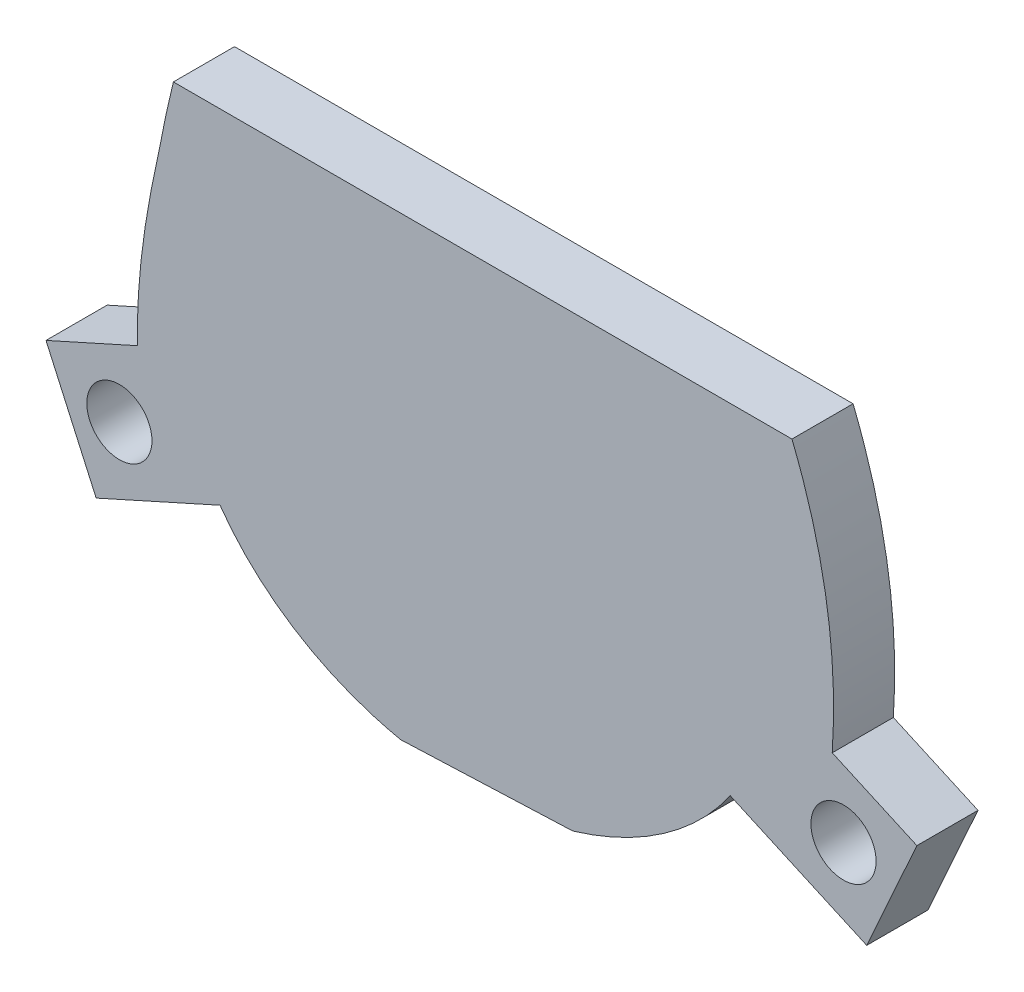
ISO-10303-21;
HEADER;
FILE_DESCRIPTION(('STEP AP214'),'2;1');
FILE_NAME('part.step','',(''),(''),'','','');
FILE_SCHEMA(('AUTOMOTIVE_DESIGN { 1 0 10303 214 1 1 1 1 }'));
ENDSEC;
DATA;
#1=APPLICATION_CONTEXT('core data for automotive mechanical design processes');
#2=APPLICATION_PROTOCOL_DEFINITION('international standard','automotive_design',2000,#1);
#3=PRODUCT_CONTEXT('',#1,'mechanical');
#4=PRODUCT('Part','Part','',(#3));
#5=PRODUCT_RELATED_PRODUCT_CATEGORY('part','',(#4));
#6=PRODUCT_DEFINITION_FORMATION('','',#4);
#7=PRODUCT_DEFINITION_CONTEXT('part definition',#1,'design');
#8=PRODUCT_DEFINITION('design','',#6,#7);
#9=PRODUCT_DEFINITION_SHAPE('','',#8);
#10=(LENGTH_UNIT() NAMED_UNIT(*) SI_UNIT(.MILLI.,.METRE.));
#11=(NAMED_UNIT(*) PLANE_ANGLE_UNIT() SI_UNIT($,.RADIAN.));
#12=(NAMED_UNIT(*) SI_UNIT($,.STERADIAN.) SOLID_ANGLE_UNIT());
#13=UNCERTAINTY_MEASURE_WITH_UNIT(LENGTH_MEASURE(1.E-05),#10,'distance_accuracy_value','');
#14=(GEOMETRIC_REPRESENTATION_CONTEXT(3) GLOBAL_UNCERTAINTY_ASSIGNED_CONTEXT((#13)) GLOBAL_UNIT_ASSIGNED_CONTEXT((#10,
#11,#12)) REPRESENTATION_CONTEXT('',''));
#15=CARTESIAN_POINT('',(0.,0.,0.));
#16=DIRECTION('',(0.,0.,1.));
#17=DIRECTION('',(1.,0.,0.));
#18=AXIS2_PLACEMENT_3D('',#15,#16,#17);
#19=CARTESIAN_POINT('',(-0.211359075610227,-1.49094523581525,-3.5));
#20=DIRECTION('',(0.,0.,1.));
#21=DIRECTION('',(-0.999851311842278,-0.0172439614727882,0.));
#22=AXIS2_PLACEMENT_3D('',#19,#20,#21);
#23=ELLIPSE('',#22,7.22658584261333,5.9792027467453);
#24=DIRECTION('',(0.,0.,1.));
#25=VECTOR('',#24,1.);
#26=SURFACE_OF_LINEAR_EXTRUSION('',#23,#25);
#27=CARTESIAN_POINT('',(-0.211359075610227,-1.49094523581525,-2.));
#28=DIRECTION('',(0.,0.,1.));
#29=DIRECTION('',(-0.999851311842278,-0.0172439614727882,0.));
#30=AXIS2_PLACEMENT_3D('',#27,#28,#29);
#31=ELLIPSE('',#30,7.22658584261333,5.9792027467453);
#32=CARTESIAN_POINT('',(-6.46467924601322,-4.52155725937641,-2.));
#33=VERTEX_POINT('',#32);
#34=CARTESIAN_POINT('',(-2.02932149220679,-7.28799866591098,-2.));
#35=VERTEX_POINT('',#34);
#36=EDGE_CURVE('E163',#33,#35,#31,.T.);
#37=ORIENTED_EDGE('',*,*,#36,.F.);
#38=DIRECTION('',(0.,0.,1.));
#39=VECTOR('',#38,1.);
#40=CARTESIAN_POINT('',(-6.46467924601322,-4.52155725937641,-3.5));
#41=LINE('',#40,#39);
#42=CARTESIAN_POINT('',(-6.46467924601322,-4.52155725937641,-3.5));
#43=VERTEX_POINT('',#42);
#44=EDGE_CURVE('E11',#43,#33,#41,.T.);
#45=ORIENTED_EDGE('',*,*,#44,.F.);
#46=CARTESIAN_POINT('',(-2.02932149220679,-7.28799866591098,-3.5));
#47=VERTEX_POINT('',#46);
#48=EDGE_CURVE('E214',#43,#47,#23,.T.);
#49=ORIENTED_EDGE('',*,*,#48,.T.);
#50=DIRECTION('',(0.,0.,1.));
#51=VECTOR('',#50,1.);
#52=CARTESIAN_POINT('',(-2.02932149220679,-7.28799866591098,-3.5));
#53=LINE('',#52,#51);
#54=EDGE_CURVE('E36',#47,#35,#53,.T.);
#55=ORIENTED_EDGE('',*,*,#54,.T.);
#56=EDGE_LOOP('',(#37,#45,#49,#55));
#57=FACE_BOUND('',#56,.T.);
#58=ADVANCED_FACE('F32',(#57),#26,.T.);
#59=CARTESIAN_POINT('',(-9.50505118567112,-5.88942803851901,-3.5));
#60=DIRECTION('',(0.410290694426528,-0.91195479387248,0.));
#61=DIRECTION('',(0.91195479387248,0.410290694426529,0.));
#62=AXIS2_PLACEMENT_3D('',#59,#60,#61);
#63=PLANE('',#62);
#64=DIRECTION('',(0.91195479387248,0.410290694426529,0.));
#65=VECTOR('',#64,1.);
#66=CARTESIAN_POINT('',(-9.50505118567112,-5.88942803851901,-2.));
#67=LINE('',#66,#65);
#68=CARTESIAN_POINT('',(-9.50505118567112,-5.88942803851901,-2.));
#69=VERTEX_POINT('',#68);
#70=EDGE_CURVE('E212',#69,#33,#67,.T.);
#71=ORIENTED_EDGE('',*,*,#70,.F.);
#72=DIRECTION('',(0.,0.,1.));
#73=VECTOR('',#72,1.);
#74=CARTESIAN_POINT('',(-9.50505118567112,-5.88942803851901,-3.5));
#75=LINE('',#74,#73);
#76=CARTESIAN_POINT('',(-9.50505118567112,-5.88942803851901,-3.5));
#77=VERTEX_POINT('',#76);
#78=EDGE_CURVE('E42',#77,#69,#75,.T.);
#79=ORIENTED_EDGE('',*,*,#78,.F.);
#80=DIRECTION('',(0.91195479387248,0.410290694426529,0.));
#81=VECTOR('',#80,1.);
#82=CARTESIAN_POINT('',(-9.50505118567112,-5.88942803851901,-3.5));
#83=LINE('',#82,#81);
#84=EDGE_CURVE('E150',#77,#43,#83,.T.);
#85=ORIENTED_EDGE('',*,*,#84,.T.);
#86=ORIENTED_EDGE('',*,*,#44,.T.);
#87=EDGE_LOOP('',(#71,#79,#85,#86));
#88=FACE_BOUND('',#87,.T.);
#89=ADVANCED_FACE('F237',(#88),#63,.T.);
#90=CARTESIAN_POINT('',(-9.50505118567112,-5.88942803851901,-3.5));
#91=DIRECTION('',(-0.911958229863014,-0.410283057150935,0.));
#92=DIRECTION('',(0.410283057150935,-0.911958229863014,0.));
#93=AXIS2_PLACEMENT_3D('',#90,#91,#92);
#94=PLANE('',#93);
#95=DIRECTION('',(0.410283057150935,-0.911958229863014,0.));
#96=VECTOR('',#95,1.);
#97=CARTESIAN_POINT('',(-9.50505118567112,-5.88942803851901,-2.));
#98=LINE('',#97,#96);
#99=CARTESIAN_POINT('',(-10.7359003568519,-3.15355334953465,-2.));
#100=VERTEX_POINT('',#99);
#101=EDGE_CURVE('E137',#100,#69,#98,.T.);
#102=ORIENTED_EDGE('',*,*,#101,.F.);
#103=DIRECTION('',(0.,0.,1.));
#104=VECTOR('',#103,1.);
#105=CARTESIAN_POINT('',(-10.7359003568519,-3.15355334953465,-3.5));
#106=LINE('',#105,#104);
#107=CARTESIAN_POINT('',(-10.7359003568519,-3.15355334953465,-3.5));
#108=VERTEX_POINT('',#107);
#109=EDGE_CURVE('E132',#108,#100,#106,.T.);
#110=ORIENTED_EDGE('',*,*,#109,.F.);
#111=DIRECTION('',(0.410283057150935,-0.911958229863014,0.));
#112=VECTOR('',#111,1.);
#113=CARTESIAN_POINT('',(-9.50505118567112,-5.88942803851901,-3.5));
#114=LINE('',#113,#112);
#115=EDGE_CURVE('E135',#108,#77,#114,.T.);
#116=ORIENTED_EDGE('',*,*,#115,.T.);
#117=ORIENTED_EDGE('',*,*,#78,.T.);
#118=EDGE_LOOP('',(#102,#110,#116,#117));
#119=FACE_BOUND('',#118,.T.);
#120=ADVANCED_FACE('F134',(#119),#94,.T.);
#121=CARTESIAN_POINT('',(-8.49160422174355,-2.14386163201845,-3.5));
#122=DIRECTION('',(-0.410283054167532,0.911958231205225,0.));
#123=DIRECTION('',(-0.911958231205225,-0.410283054167532,0.));
#124=AXIS2_PLACEMENT_3D('',#121,#122,#123);
#125=PLANE('',#124);
#126=DIRECTION('',(-0.911958231205225,-0.410283054167532,0.));
#127=VECTOR('',#126,1.);
#128=CARTESIAN_POINT('',(-8.49160422174355,-2.14386163201845,-2.));
#129=LINE('',#128,#127);
#130=CARTESIAN_POINT('',(-8.49160422174355,-2.14386163201845,-2.));
#131=VERTEX_POINT('',#130);
#132=EDGE_CURVE('E206',#131,#100,#129,.T.);
#133=ORIENTED_EDGE('',*,*,#132,.F.);
#134=DIRECTION('',(0.,0.,1.));
#135=VECTOR('',#134,1.);
#136=CARTESIAN_POINT('',(-8.49160422174355,-2.14386163201845,-3.5));
#137=LINE('',#136,#135);
#138=CARTESIAN_POINT('',(-8.49160422174355,-2.14386163201845,-3.5));
#139=VERTEX_POINT('',#138);
#140=EDGE_CURVE('E142',#139,#131,#137,.T.);
#141=ORIENTED_EDGE('',*,*,#140,.F.);
#142=DIRECTION('',(-0.911958231205225,-0.410283054167532,0.));
#143=VECTOR('',#142,1.);
#144=CARTESIAN_POINT('',(-8.49160422174355,-2.14386163201845,-3.5));
#145=LINE('',#144,#143);
#146=EDGE_CURVE('E148',#139,#108,#145,.T.);
#147=ORIENTED_EDGE('',*,*,#146,.T.);
#148=ORIENTED_EDGE('',*,*,#109,.T.);
#149=EDGE_LOOP('',(#133,#141,#147,#148));
#150=FACE_BOUND('',#149,.T.);
#151=ADVANCED_FACE('F152',(#150),#125,.T.);
#152=CARTESIAN_POINT('',(-7.95528081982098,2.2951044150018,-3.5));
#153=CARTESIAN_POINT('',(-8.19765269203481,1.21578461180034,-3.5));
#154=CARTESIAN_POINT('',(-8.46118882699785,-0.260180468426476,-3.5));
#155=CARTESIAN_POINT('',(-8.49754162805172,-1.75305516766509,-3.5));
#156=CARTESIAN_POINT('',(-8.49160422174355,-2.14386163201845,-3.5));
#157=B_SPLINE_CURVE_WITH_KNOTS('',3,(#152,#153,#154,#155,#156),.UNSPECIFIED.,.F.,.F.,(4,1,4),
(0.593149099847948,0.778458970839469,0.844123549627682),.UNSPECIFIED.);
#158=DIRECTION('',(0.,0.,1.));
#159=VECTOR('',#158,1.);
#160=SURFACE_OF_LINEAR_EXTRUSION('',#157,#159);
#161=CARTESIAN_POINT('',(-7.95528081982098,2.2951044150018,-2.));
#162=CARTESIAN_POINT('',(-8.19765269203481,1.21578461180034,-2.));
#163=CARTESIAN_POINT('',(-8.46118882699785,-0.260180468426476,-2.));
#164=CARTESIAN_POINT('',(-8.49754162805172,-1.75305516766509,-2.));
#165=CARTESIAN_POINT('',(-8.49160422174355,-2.14386163201845,-2.));
#166=B_SPLINE_CURVE_WITH_KNOTS('',3,(#161,#162,#163,#164,#165),.UNSPECIFIED.,.F.,.F.,(4,1,4),
(0.593149099847948,0.778458970839469,0.844123549627682),.UNSPECIFIED.);
#167=CARTESIAN_POINT('',(-7.95528081982098,2.2951044150018,-2.));
#168=VERTEX_POINT('',#167);
#169=EDGE_CURVE('E198',#168,#131,#166,.T.);
#170=ORIENTED_EDGE('',*,*,#169,.F.);
#171=DIRECTION('',(0.,0.,1.));
#172=VECTOR('',#171,1.);
#173=CARTESIAN_POINT('',(-7.95528081982098,2.2951044150018,-3.5));
#174=LINE('',#173,#172);
#175=CARTESIAN_POINT('',(-7.95528081982098,2.2951044150018,-3.5));
#176=VERTEX_POINT('',#175);
#177=EDGE_CURVE('E218',#176,#168,#174,.T.);
#178=ORIENTED_EDGE('',*,*,#177,.F.);
#179=EDGE_CURVE('E153',#176,#139,#157,.T.);
#180=ORIENTED_EDGE('',*,*,#179,.T.);
#181=ORIENTED_EDGE('',*,*,#140,.T.);
#182=EDGE_LOOP('',(#170,#178,#180,#181));
#183=FACE_BOUND('',#182,.T.);
#184=ADVANCED_FACE('F250',(#183),#160,.T.);
#185=CARTESIAN_POINT('',(-7.31832872905544,4.84576859654767,-3.5));
#186=CARTESIAN_POINT('',(-7.61806638745173,4.03748517459709,-3.5));
#187=CARTESIAN_POINT('',(-7.7869729723053,3.16101255325552,-3.5));
#188=CARTESIAN_POINT('',(-7.95528081982013,2.2951044150062,-3.5));
#189=B_SPLINE_CURVE_WITH_KNOTS('',3,(#185,#186,#187,#188),.UNSPECIFIED.,.F.,.F.,(4,4),
(0.598753878324993,0.774720509103669),.UNSPECIFIED.);
#190=DIRECTION('',(0.,0.,1.));
#191=VECTOR('',#190,1.);
#192=SURFACE_OF_LINEAR_EXTRUSION('',#189,#191);
#193=CARTESIAN_POINT('',(-7.31832872905544,4.84576859654767,-2.));
#194=CARTESIAN_POINT('',(-7.61806638745173,4.03748517459709,-2.));
#195=CARTESIAN_POINT('',(-7.7869729723053,3.16101255325552,-2.));
#196=CARTESIAN_POINT('',(-7.95528081982013,2.2951044150062,-2.));
#197=B_SPLINE_CURVE_WITH_KNOTS('',3,(#193,#194,#195,#196),.UNSPECIFIED.,.F.,.F.,(4,4),
(0.598753878324993,0.774720509103669),.UNSPECIFIED.);
#198=CARTESIAN_POINT('',(-7.60927041847635,3.90386544157639,-2.));
#199=VERTEX_POINT('',#198);
#200=EDGE_CURVE('E193',#199,#168,#197,.T.);
#201=ORIENTED_EDGE('',*,*,#200,.F.);
#202=DIRECTION('',(0.,0.,1.));
#203=VECTOR('',#202,1.);
#204=CARTESIAN_POINT('',(-7.60927041847635,3.90386544157639,-3.5));
#205=LINE('',#204,#203);
#206=CARTESIAN_POINT('',(-7.60927041847635,3.90386544157639,-3.5));
#207=VERTEX_POINT('',#206);
#208=EDGE_CURVE('E220',#207,#199,#205,.T.);
#209=ORIENTED_EDGE('',*,*,#208,.F.);
#210=EDGE_CURVE('E155',#207,#176,#189,.T.);
#211=ORIENTED_EDGE('',*,*,#210,.T.);
#212=ORIENTED_EDGE('',*,*,#177,.T.);
#213=EDGE_LOOP('',(#201,#209,#211,#212));
#214=FACE_BOUND('',#213,.T.);
#215=ADVANCED_FACE('F253',(#214),#192,.T.);
#216=CARTESIAN_POINT('',(-6.28103773119068,3.90386544158638,-3.5));
#217=DIRECTION('',(0.,1.,0.));
#218=DIRECTION('',(0.,0.,1.));
#219=AXIS2_PLACEMENT_3D('',#216,#217,#218);
#220=PLANE('',#219);
#221=DIRECTION('',(-1.,0.,0.));
#222=VECTOR('',#221,1.);
#223=CARTESIAN_POINT('',(-6.28103773119068,3.90386544158638,-2.));
#224=LINE('',#223,#222);
#225=CARTESIAN_POINT('',(7.57167685297727,3.90386544158638,-2.));
#226=VERTEX_POINT('',#225);
#227=EDGE_CURVE('E187',#226,#199,#224,.T.);
#228=ORIENTED_EDGE('',*,*,#227,.F.);
#229=DIRECTION('',(0.,0.,1.));
#230=VECTOR('',#229,1.);
#231=CARTESIAN_POINT('',(7.57167685297727,3.90386544158638,-3.5));
#232=LINE('',#231,#230);
#233=CARTESIAN_POINT('',(7.57167685297727,3.90386544158638,-3.5));
#234=VERTEX_POINT('',#233);
#235=EDGE_CURVE('E222',#234,#226,#232,.T.);
#236=ORIENTED_EDGE('',*,*,#235,.F.);
#237=DIRECTION('',(-1.,0.,0.));
#238=VECTOR('',#237,1.);
#239=CARTESIAN_POINT('',(7.57167685297727,3.90386544158638,-3.5));
#240=LINE('',#239,#238);
#241=EDGE_CURVE('E265',#234,#207,#240,.T.);
#242=ORIENTED_EDGE('',*,*,#241,.T.);
#243=ORIENTED_EDGE('',*,*,#208,.T.);
#244=EDGE_LOOP('',(#228,#236,#242,#243));
#245=FACE_BOUND('',#244,.T.);
#246=ADVANCED_FACE('F257',(#245),#220,.T.);
#247=CARTESIAN_POINT('',(-988189.915219851,-153267.795653087,-3.5));
#248=CARTESIAN_POINT('',(988979.734223857,148108.070425656,-3.5));
#249=CARTESIAN_POINT('',(-989735.785108005,-142945.410727394,-3.5));
#250=B_SPLINE_CURVE_WITH_KNOTS('',2,(#247,#248,#249),.UNSPECIFIED.,.F.,.F.,(3,3),(0.,1.),.UNSPECIFIED.);
#251=DIRECTION('',(0.,0.,1.));
#252=VECTOR('',#251,1.);
#253=SURFACE_OF_LINEAR_EXTRUSION('',#250,#252);
#254=CARTESIAN_POINT('',(-988189.915219851,-153267.795653087,-2.));
#255=CARTESIAN_POINT('',(988979.734223857,148108.070425656,-2.));
#256=CARTESIAN_POINT('',(-989735.785108005,-142945.410727394,-2.));
#257=B_SPLINE_CURVE_WITH_KNOTS('',2,(#254,#255,#256),.UNSPECIFIED.,.F.,.F.,(3,3),(0.,1.),.UNSPECIFIED.);
#258=CARTESIAN_POINT('',(8.56036238406636,-2.27017238583915,-2.));
#259=VERTEX_POINT('',#258);
#260=EDGE_CURVE('E182',#259,#226,#257,.T.);
#261=ORIENTED_EDGE('',*,*,#260,.F.);
#262=DIRECTION('',(0.,0.,1.));
#263=VECTOR('',#262,1.);
#264=CARTESIAN_POINT('',(8.56036238406636,-2.27017238583915,-3.5));
#265=LINE('',#264,#263);
#266=CARTESIAN_POINT('',(8.56036238406636,-2.27017238583915,-3.5));
#267=VERTEX_POINT('',#266);
#268=EDGE_CURVE('E225',#267,#259,#265,.T.);
#269=ORIENTED_EDGE('',*,*,#268,.F.);
#270=EDGE_CURVE('E270',#267,#234,#250,.T.);
#271=ORIENTED_EDGE('',*,*,#270,.T.);
#272=ORIENTED_EDGE('',*,*,#235,.T.);
#273=EDGE_LOOP('',(#261,#269,#271,#272));
#274=FACE_BOUND('',#273,.T.);
#275=ADVANCED_FACE('F281',(#274),#253,.T.);
#276=CARTESIAN_POINT('',(8.56036238409281,-2.27017238427056,-3.5));
#277=DIRECTION('',(0.410283057538818,0.911958229688509,0.));
#278=DIRECTION('',(-0.911958229688509,0.410283057538818,0.));
#279=AXIS2_PLACEMENT_3D('',#276,#277,#278);
#280=PLANE('',#279);
#281=DIRECTION('',(-0.911958229688509,0.410283057538818,0.));
#282=VECTOR('',#281,1.);
#283=CARTESIAN_POINT('',(8.56036238409281,-2.27017238427056,-2.));
#284=LINE('',#283,#282);
#285=CARTESIAN_POINT('',(10.6376342317982,-3.20472115774563,-2.));
#286=VERTEX_POINT('',#285);
#287=EDGE_CURVE('E179',#286,#259,#284,.T.);
#288=ORIENTED_EDGE('',*,*,#287,.F.);
#289=DIRECTION('',(0.,0.,1.));
#290=VECTOR('',#289,1.);
#291=CARTESIAN_POINT('',(10.6376342317982,-3.20472115774563,-3.5));
#292=LINE('',#291,#290);
#293=CARTESIAN_POINT('',(10.6376342317982,-3.20472115774563,-3.5));
#294=VERTEX_POINT('',#293);
#295=EDGE_CURVE('E227',#294,#286,#292,.T.);
#296=ORIENTED_EDGE('',*,*,#295,.F.);
#297=DIRECTION('',(-0.911958229688509,0.410283057538818,0.));
#298=VECTOR('',#297,1.);
#299=CARTESIAN_POINT('',(8.56036238409281,-2.27017238427056,-3.5));
#300=LINE('',#299,#298);
#301=EDGE_CURVE('E276',#294,#267,#300,.T.);
#302=ORIENTED_EDGE('',*,*,#301,.T.);
#303=ORIENTED_EDGE('',*,*,#268,.T.);
#304=EDGE_LOOP('',(#288,#296,#302,#303));
#305=FACE_BOUND('',#304,.T.);
#306=ADVANCED_FACE('F284',(#305),#280,.T.);
#307=CARTESIAN_POINT('',(9.40678505918179,-5.94059584681116,-3.5));
#308=DIRECTION('',(0.911958229688509,-0.410283057538817,0.));
#309=DIRECTION('',(0.410283057538817,0.911958229688509,0.));
#310=AXIS2_PLACEMENT_3D('',#307,#308,#309);
#311=PLANE('',#310);
#312=DIRECTION('',(0.410283057538817,0.911958229688509,0.));
#313=VECTOR('',#312,1.);
#314=CARTESIAN_POINT('',(9.40678505918179,-5.94059584681116,-2.));
#315=LINE('',#314,#313);
#316=CARTESIAN_POINT('',(9.40678505918179,-5.94059584681116,-2.));
#317=VERTEX_POINT('',#316);
#318=EDGE_CURVE('E176',#317,#286,#315,.T.);
#319=ORIENTED_EDGE('',*,*,#318,.F.);
#320=DIRECTION('',(0.,0.,1.));
#321=VECTOR('',#320,1.);
#322=CARTESIAN_POINT('',(9.40678505918179,-5.94059584681116,-3.5));
#323=LINE('',#322,#321);
#324=CARTESIAN_POINT('',(9.40678505918179,-5.94059584681116,-3.5));
#325=VERTEX_POINT('',#324);
#326=EDGE_CURVE('E229',#325,#317,#323,.T.);
#327=ORIENTED_EDGE('',*,*,#326,.F.);
#328=DIRECTION('',(0.410283057538817,0.911958229688509,0.));
#329=VECTOR('',#328,1.);
#330=CARTESIAN_POINT('',(9.40678505918179,-5.94059584681116,-3.5));
#331=LINE('',#330,#329);
#332=EDGE_CURVE('E309',#325,#294,#331,.T.);
#333=ORIENTED_EDGE('',*,*,#332,.T.);
#334=ORIENTED_EDGE('',*,*,#295,.T.);
#335=EDGE_LOOP('',(#319,#327,#333,#334));
#336=FACE_BOUND('',#335,.T.);
#337=ADVANCED_FACE('F288',(#336),#311,.T.);
#338=CARTESIAN_POINT('',(9.40678505918179,-5.94059584681116,-3.5));
#339=DIRECTION('',(-0.410283057538818,-0.911958229688509,0.));
#340=DIRECTION('',(0.911958229688509,-0.410283057538818,0.));
#341=AXIS2_PLACEMENT_3D('',#338,#339,#340);
#342=PLANE('',#341);
#343=DIRECTION('',(0.911958229688509,-0.410283057538818,0.));
#344=VECTOR('',#343,1.);
#345=CARTESIAN_POINT('',(9.40678505918179,-5.94059584681116,-2.));
#346=LINE('',#345,#344);
#347=CARTESIAN_POINT('',(6.05610845319689,-4.43315197715407,-2.));
#348=VERTEX_POINT('',#347);
#349=EDGE_CURVE('E173',#348,#317,#346,.T.);
#350=ORIENTED_EDGE('',*,*,#349,.F.);
#351=DIRECTION('',(0.,0.,1.));
#352=VECTOR('',#351,1.);
#353=CARTESIAN_POINT('',(6.05610845319689,-4.43315197715407,-3.5));
#354=LINE('',#353,#352);
#355=CARTESIAN_POINT('',(6.05610845319689,-4.43315197715407,-3.5));
#356=VERTEX_POINT('',#355);
#357=EDGE_CURVE('E231',#356,#348,#354,.T.);
#358=ORIENTED_EDGE('',*,*,#357,.F.);
#359=DIRECTION('',(0.911958229688509,-0.410283057538818,0.));
#360=VECTOR('',#359,1.);
#361=CARTESIAN_POINT('',(9.40678505918179,-5.94059584681116,-3.5));
#362=LINE('',#361,#360);
#363=EDGE_CURVE('E306',#356,#325,#362,.T.);
#364=ORIENTED_EDGE('',*,*,#363,.T.);
#365=ORIENTED_EDGE('',*,*,#326,.T.);
#366=EDGE_LOOP('',(#350,#358,#364,#365));
#367=FACE_BOUND('',#366,.T.);
#368=ADVANCED_FACE('F292',(#367),#342,.T.);
#369=CARTESIAN_POINT('',(-0.211359075610227,-1.49094523581525,-3.5));
#370=DIRECTION('',(0.,0.,1.));
#371=DIRECTION('',(-0.999851311842278,-0.0172439614727881,0.));
#372=AXIS2_PLACEMENT_3D('',#369,#370,#371);
#373=ELLIPSE('',#372,7.22658584261333,5.9792027467453);
#374=DIRECTION('',(0.,0.,1.));
#375=VECTOR('',#374,1.);
#376=SURFACE_OF_LINEAR_EXTRUSION('',#373,#375);
#377=CARTESIAN_POINT('',(-0.211359075610227,-1.49094523581525,-2.));
#378=DIRECTION('',(0.,0.,1.));
#379=DIRECTION('',(-0.999851311842278,-0.0172439614727881,0.));
#380=AXIS2_PLACEMENT_3D('',#377,#378,#379);
#381=ELLIPSE('',#380,7.22658584261333,5.9792027467453);
#382=CARTESIAN_POINT('',(2.19112814654262,-7.11721836899377,-2.));
#383=VERTEX_POINT('',#382);
#384=EDGE_CURVE('E170',#383,#348,#381,.T.);
#385=ORIENTED_EDGE('',*,*,#384,.F.);
#386=DIRECTION('',(0.,0.,1.));
#387=VECTOR('',#386,1.);
#388=CARTESIAN_POINT('',(2.19112814654262,-7.11721836899377,-3.5));
#389=LINE('',#388,#387);
#390=CARTESIAN_POINT('',(2.19112814654262,-7.11721836899377,-3.5));
#391=VERTEX_POINT('',#390);
#392=EDGE_CURVE('E232',#391,#383,#389,.T.);
#393=ORIENTED_EDGE('',*,*,#392,.F.);
#394=EDGE_CURVE('E301',#391,#356,#373,.T.);
#395=ORIENTED_EDGE('',*,*,#394,.T.);
#396=ORIENTED_EDGE('',*,*,#357,.T.);
#397=EDGE_LOOP('',(#385,#393,#395,#396));
#398=FACE_BOUND('',#397,.T.);
#399=ADVANCED_FACE('F296',(#398),#376,.T.);
#400=CARTESIAN_POINT('',(2.19112814654262,-7.11721836899376,-3.5));
#401=DIRECTION('',(0.0404318648732683,-0.999182297833018,0.));
#402=DIRECTION('',(0.999182297833018,0.0404318648732683,0.));
#403=AXIS2_PLACEMENT_3D('',#400,#401,#402);
#404=PLANE('',#403);
#405=DIRECTION('',(0.999182297833018,0.0404318648732683,0.));
#406=VECTOR('',#405,1.);
#407=CARTESIAN_POINT('',(2.19112814654262,-7.11721836899376,-2.));
#408=LINE('',#407,#406);
#409=EDGE_CURVE('E166',#35,#383,#408,.T.);
#410=ORIENTED_EDGE('',*,*,#409,.F.);
#411=ORIENTED_EDGE('',*,*,#54,.F.);
#412=DIRECTION('',(0.999182297833018,0.0404318648732683,0.));
#413=VECTOR('',#412,1.);
#414=CARTESIAN_POINT('',(2.19112814654262,-7.11721836899376,-3.5));
#415=LINE('',#414,#413);
#416=EDGE_CURVE('E307',#47,#391,#415,.T.);
#417=ORIENTED_EDGE('',*,*,#416,.T.);
#418=ORIENTED_EDGE('',*,*,#392,.T.);
#419=EDGE_LOOP('',(#410,#411,#417,#418));
#420=FACE_BOUND('',#419,.T.);
#421=ADVANCED_FACE('F234',(#420),#404,.T.);
#422=CARTESIAN_POINT('',(-0.211359075610227,-1.49094523581525,-3.5));
#423=DIRECTION('',(0.,0.,1.));
#424=DIRECTION('',(1.,0.,0.));
#425=AXIS2_PLACEMENT_3D('',#422,#423,#424);
#426=PLANE('',#425);
#427=CARTESIAN_POINT('',(-8.93493007055869,-3.98812272391138,-3.5));
#428=DIRECTION('',(0.,0.,1.));
#429=DIRECTION('',(1.,0.,0.));
#430=AXIS2_PLACEMENT_3D('',#427,#428,#429);
#431=CIRCLE('',#430,0.800000000000001);
#432=CARTESIAN_POINT('',(-8.13493007055869,-3.98812272391138,-3.5));
#433=VERTEX_POINT('',#432);
#434=EDGE_CURVE('E328',#433,#433,#431,.T.);
#435=ORIENTED_EDGE('',*,*,#434,.T.);
#436=EDGE_LOOP('',(#435));
#437=FACE_BOUND('',#436,.T.);
#438=CARTESIAN_POINT('',(8.83666394689495,-4.03929052747793,-3.5));
#439=DIRECTION('',(0.,0.,1.));
#440=DIRECTION('',(1.,0.,0.));
#441=AXIS2_PLACEMENT_3D('',#438,#439,#440);
#442=CIRCLE('',#441,0.800000000000001);
#443=CARTESIAN_POINT('',(9.63666394689495,-4.03929052747793,-3.5));
#444=VERTEX_POINT('',#443);
#445=EDGE_CURVE('E167',#444,#444,#442,.T.);
#446=ORIENTED_EDGE('',*,*,#445,.T.);
#447=EDGE_LOOP('',(#446));
#448=FACE_BOUND('',#447,.T.);
#449=ORIENTED_EDGE('',*,*,#48,.F.);
#450=ORIENTED_EDGE('',*,*,#84,.F.);
#451=ORIENTED_EDGE('',*,*,#115,.F.);
#452=ORIENTED_EDGE('',*,*,#146,.F.);
#453=ORIENTED_EDGE('',*,*,#179,.F.);
#454=ORIENTED_EDGE('',*,*,#210,.F.);
#455=ORIENTED_EDGE('',*,*,#241,.F.);
#456=ORIENTED_EDGE('',*,*,#270,.F.);
#457=ORIENTED_EDGE('',*,*,#301,.F.);
#458=ORIENTED_EDGE('',*,*,#332,.F.);
#459=ORIENTED_EDGE('',*,*,#363,.F.);
#460=ORIENTED_EDGE('',*,*,#394,.F.);
#461=ORIENTED_EDGE('',*,*,#416,.F.);
#462=EDGE_LOOP('',(#449,#450,#451,#452,#453,#454,#455,#456,#457,#458,#459,#460,#461));
#463=FACE_BOUND('',#462,.T.);
#464=ADVANCED_FACE('F146',(#437,#448,#463),#426,.F.);
#465=CARTESIAN_POINT('',(-0.211359075610227,-1.49094523581525,-2.));
#466=DIRECTION('',(0.,0.,1.));
#467=DIRECTION('',(1.,0.,0.));
#468=AXIS2_PLACEMENT_3D('',#465,#466,#467);
#469=PLANE('',#468);
#470=CARTESIAN_POINT('',(-8.93493007055869,-3.98812272391138,-2.));
#471=DIRECTION('',(0.,0.,1.));
#472=DIRECTION('',(1.,0.,0.));
#473=AXIS2_PLACEMENT_3D('',#470,#471,#472);
#474=CIRCLE('',#473,0.800000000000001);
#475=CARTESIAN_POINT('',(-8.13493007055869,-3.98812272391138,-2.));
#476=VERTEX_POINT('',#475);
#477=EDGE_CURVE('E331',#476,#476,#474,.T.);
#478=ORIENTED_EDGE('',*,*,#477,.F.);
#479=EDGE_LOOP('',(#478));
#480=FACE_BOUND('',#479,.T.);
#481=CARTESIAN_POINT('',(8.83666394689495,-4.03929052747793,-2.));
#482=DIRECTION('',(0.,0.,1.));
#483=DIRECTION('',(1.,0.,0.));
#484=AXIS2_PLACEMENT_3D('',#481,#482,#483);
#485=CIRCLE('',#484,0.800000000000001);
#486=CARTESIAN_POINT('',(9.63666394689495,-4.03929052747793,-2.));
#487=VERTEX_POINT('',#486);
#488=EDGE_CURVE('E325',#487,#487,#485,.T.);
#489=ORIENTED_EDGE('',*,*,#488,.F.);
#490=EDGE_LOOP('',(#489));
#491=FACE_BOUND('',#490,.T.);
#492=ORIENTED_EDGE('',*,*,#36,.T.);
#493=ORIENTED_EDGE('',*,*,#409,.T.);
#494=ORIENTED_EDGE('',*,*,#384,.T.);
#495=ORIENTED_EDGE('',*,*,#349,.T.);
#496=ORIENTED_EDGE('',*,*,#318,.T.);
#497=ORIENTED_EDGE('',*,*,#287,.T.);
#498=ORIENTED_EDGE('',*,*,#260,.T.);
#499=ORIENTED_EDGE('',*,*,#227,.T.);
#500=ORIENTED_EDGE('',*,*,#200,.T.);
#501=ORIENTED_EDGE('',*,*,#169,.T.);
#502=ORIENTED_EDGE('',*,*,#132,.T.);
#503=ORIENTED_EDGE('',*,*,#101,.T.);
#504=ORIENTED_EDGE('',*,*,#70,.T.);
#505=EDGE_LOOP('',(#492,#493,#494,#495,#496,#497,#498,#499,#500,#501,#502,#503,#504));
#506=FACE_BOUND('',#505,.T.);
#507=ADVANCED_FACE('F236',(#480,#491,#506),#469,.T.);
#508=CARTESIAN_POINT('',(8.83666394689495,-4.03929052747793,-3.5));
#509=DIRECTION('',(0.,0.,1.));
#510=DIRECTION('',(1.,0.,0.));
#511=AXIS2_PLACEMENT_3D('',#508,#509,#510);
#512=CYLINDRICAL_SURFACE('',#511,0.800000000000001);
#513=ORIENTED_EDGE('',*,*,#445,.F.);
#514=EDGE_LOOP('',(#513));
#515=FACE_BOUND('',#514,.T.);
#516=ORIENTED_EDGE('',*,*,#488,.T.);
#517=EDGE_LOOP('',(#516));
#518=FACE_BOUND('',#517,.T.);
#519=ADVANCED_FACE('F342',(#515,#518),#512,.F.);
#520=CARTESIAN_POINT('',(-8.93493007055869,-3.98812272391138,-3.5));
#521=DIRECTION('',(0.,0.,1.));
#522=DIRECTION('',(1.,0.,0.));
#523=AXIS2_PLACEMENT_3D('',#520,#521,#522);
#524=CYLINDRICAL_SURFACE('',#523,0.800000000000001);
#525=ORIENTED_EDGE('',*,*,#434,.F.);
#526=EDGE_LOOP('',(#525));
#527=FACE_BOUND('',#526,.T.);
#528=ORIENTED_EDGE('',*,*,#477,.T.);
#529=EDGE_LOOP('',(#528));
#530=FACE_BOUND('',#529,.T.);
#531=ADVANCED_FACE('F339',(#527,#530),#524,.F.);
#532=CLOSED_SHELL('',(#58,#89,#120,#151,#184,#215,#246,#275,#306,#337,#368,#399,#421,#464,#507,
#519,#531));
#533=MANIFOLD_SOLID_BREP('B2',#532);
#534=ADVANCED_BREP_SHAPE_REPRESENTATION('',(#18,#533),#14);
#535=SHAPE_DEFINITION_REPRESENTATION(#9,#534);
ENDSEC;
END-ISO-10303-21;
